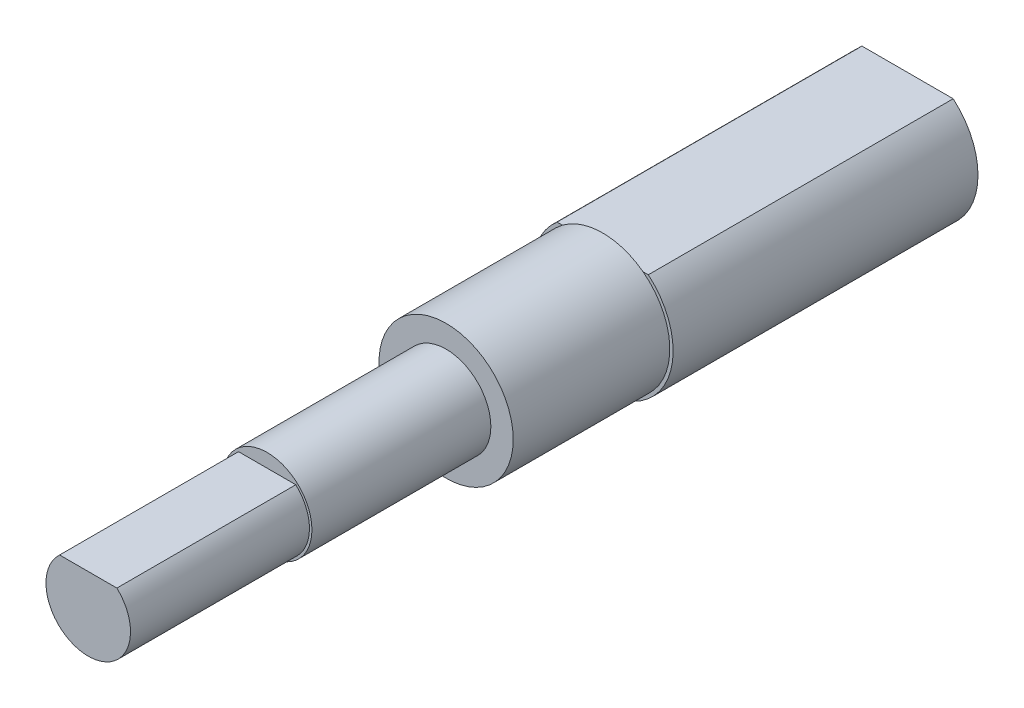
ISO-10303-21;
HEADER;
FILE_DESCRIPTION(('STEP AP214'),'2;1');
FILE_NAME('part.step','',(''),(''),'','','');
FILE_SCHEMA(('AUTOMOTIVE_DESIGN { 1 0 10303 214 1 1 1 1 }'));
ENDSEC;
DATA;
#1=APPLICATION_CONTEXT('core data for automotive mechanical design processes');
#2=APPLICATION_PROTOCOL_DEFINITION('international standard','automotive_design',2000,#1);
#3=PRODUCT_CONTEXT('',#1,'mechanical');
#4=PRODUCT('Part','Part','',(#3));
#5=PRODUCT_RELATED_PRODUCT_CATEGORY('part','',(#4));
#6=PRODUCT_DEFINITION_FORMATION('','',#4);
#7=PRODUCT_DEFINITION_CONTEXT('part definition',#1,'design');
#8=PRODUCT_DEFINITION('design','',#6,#7);
#9=PRODUCT_DEFINITION_SHAPE('','',#8);
#10=(LENGTH_UNIT() NAMED_UNIT(*) SI_UNIT(.MILLI.,.METRE.));
#11=(NAMED_UNIT(*) PLANE_ANGLE_UNIT() SI_UNIT($,.RADIAN.));
#12=(NAMED_UNIT(*) SI_UNIT($,.STERADIAN.) SOLID_ANGLE_UNIT());
#13=UNCERTAINTY_MEASURE_WITH_UNIT(LENGTH_MEASURE(1.E-05),#10,'distance_accuracy_value','');
#14=(GEOMETRIC_REPRESENTATION_CONTEXT(3) GLOBAL_UNCERTAINTY_ASSIGNED_CONTEXT((#13)) GLOBAL_UNIT_ASSIGNED_CONTEXT((#10,
#11,#12)) REPRESENTATION_CONTEXT('',''));
#15=CARTESIAN_POINT('',(0.,0.,0.));
#16=DIRECTION('',(0.,0.,1.));
#17=DIRECTION('',(1.,0.,0.));
#18=AXIS2_PLACEMENT_3D('',#15,#16,#17);
#19=CARTESIAN_POINT('',(0.,0.,21.637500032));
#20=DIRECTION('',(0.,0.,-1.));
#21=DIRECTION('',(-1.,0.,0.));
#22=AXIS2_PLACEMENT_3D('',#19,#20,#21);
#23=CYLINDRICAL_SURFACE('',#22,5.);
#24=CARTESIAN_POINT('',(0.,0.,21.637500032));
#25=DIRECTION('',(0.,0.,1.));
#26=DIRECTION('',(1.,0.,0.));
#27=AXIS2_PLACEMENT_3D('',#24,#25,#26);
#28=CIRCLE('',#27,5.);
#29=CARTESIAN_POINT('',(-3.23862040217358,3.809375,21.637500032));
#30=VERTEX_POINT('',#29);
#31=CARTESIAN_POINT('',(3.23862040217358,3.809375,21.637500032));
#32=VERTEX_POINT('',#31);
#33=EDGE_CURVE('E144',#30,#32,#28,.T.);
#34=ORIENTED_EDGE('',*,*,#33,.F.);
#35=DIRECTION('',(0.,0.,-1.));
#36=VECTOR('',#35,1.);
#37=CARTESIAN_POINT('',(-3.23862040217358,3.809375,21.637500032));
#38=LINE('',#37,#36);
#39=CARTESIAN_POINT('',(-3.23862040217358,3.809375,0.));
#40=VERTEX_POINT('',#39);
#41=EDGE_CURVE('E126',#30,#40,#38,.T.);
#42=ORIENTED_EDGE('',*,*,#41,.T.);
#43=CARTESIAN_POINT('',(0.,0.,0.));
#44=DIRECTION('',(0.,0.,1.));
#45=DIRECTION('',(1.,0.,0.));
#46=AXIS2_PLACEMENT_3D('',#43,#44,#45);
#47=CIRCLE('',#46,5.);
#48=CARTESIAN_POINT('',(3.23862040217358,3.809375,0.));
#49=VERTEX_POINT('',#48);
#50=EDGE_CURVE('E139',#40,#49,#47,.T.);
#51=ORIENTED_EDGE('',*,*,#50,.T.);
#52=DIRECTION('',(0.,0.,-1.));
#53=VECTOR('',#52,1.);
#54=CARTESIAN_POINT('',(3.23862040217358,3.809375,21.637500032));
#55=LINE('',#54,#53);
#56=EDGE_CURVE('E122',#49,#32,#55,.F.);
#57=ORIENTED_EDGE('',*,*,#56,.T.);
#58=EDGE_LOOP('',(#34,#42,#51,#57));
#59=FACE_BOUND('',#58,.T.);
#60=ADVANCED_FACE('F40',(#59),#23,.T.);
#61=CARTESIAN_POINT('',(0.,0.,21.637500032));
#62=DIRECTION('',(0.,0.,1.));
#63=DIRECTION('',(1.,0.,0.));
#64=AXIS2_PLACEMENT_3D('',#61,#62,#63);
#65=PLANE('',#64);
#66=DIRECTION('',(-1.,0.,0.));
#67=VECTOR('',#66,1.);
#68=CARTESIAN_POINT('',(-12.7,3.809375,21.637500032));
#69=LINE('',#68,#67);
#70=CARTESIAN_POINT('',(-2.85833314352526,3.809375,21.637500032));
#71=VERTEX_POINT('',#70);
#72=EDGE_CURVE('E117',#71,#30,#69,.T.);
#73=ORIENTED_EDGE('',*,*,#72,.T.);
#74=ORIENTED_EDGE('',*,*,#33,.T.);
#75=CARTESIAN_POINT('',(2.85833314352526,3.809375,21.637500032));
#76=VERTEX_POINT('',#75);
#77=EDGE_CURVE('E121',#32,#76,#69,.T.);
#78=ORIENTED_EDGE('',*,*,#77,.T.);
#79=CARTESIAN_POINT('',(0.,0.,21.637500032));
#80=DIRECTION('',(0.,0.,1.));
#81=DIRECTION('',(1.,0.,0.));
#82=AXIS2_PLACEMENT_3D('',#79,#80,#81);
#83=CIRCLE('',#82,4.7625);
#84=EDGE_CURVE('E143',#71,#76,#83,.T.);
#85=ORIENTED_EDGE('',*,*,#84,.F.);
#86=EDGE_LOOP('',(#73,#74,#78,#85));
#87=FACE_BOUND('',#86,.T.);
#88=ADVANCED_FACE('F176',(#87),#65,.T.);
#89=CARTESIAN_POINT('',(0.,0.,0.));
#90=DIRECTION('',(0.,0.,1.));
#91=DIRECTION('',(1.,0.,0.));
#92=AXIS2_PLACEMENT_3D('',#89,#90,#91);
#93=PLANE('',#92);
#94=ORIENTED_EDGE('',*,*,#50,.F.);
#95=DIRECTION('',(1.,0.,0.));
#96=VECTOR('',#95,1.);
#97=CARTESIAN_POINT('',(0.,3.809375,0.));
#98=LINE('',#97,#96);
#99=EDGE_CURVE('E108',#40,#49,#98,.T.);
#100=ORIENTED_EDGE('',*,*,#99,.T.);
#101=EDGE_LOOP('',(#94,#100));
#102=FACE_BOUND('',#101,.T.);
#103=ADVANCED_FACE('F153',(#102),#93,.F.);
#104=CARTESIAN_POINT('',(0.,0.,32.750000032));
#105=DIRECTION('',(0.,0.,-1.));
#106=DIRECTION('',(-1.,0.,0.));
#107=AXIS2_PLACEMENT_3D('',#104,#105,#106);
#108=CYLINDRICAL_SURFACE('',#107,4.7625);
#109=CARTESIAN_POINT('',(0.,0.,32.750000032));
#110=DIRECTION('',(0.,0.,1.));
#111=DIRECTION('',(1.,0.,0.));
#112=AXIS2_PLACEMENT_3D('',#109,#110,#111);
#113=CIRCLE('',#112,4.7625);
#114=CARTESIAN_POINT('',(4.7625,0.,32.750000032));
#115=VERTEX_POINT('',#114);
#116=EDGE_CURVE('E133',#115,#115,#113,.T.);
#117=ORIENTED_EDGE('',*,*,#116,.F.);
#118=EDGE_LOOP('',(#117));
#119=FACE_BOUND('',#118,.T.);
#120=EDGE_CURVE('E136',#76,#71,#83,.T.);
#121=ORIENTED_EDGE('',*,*,#120,.T.);
#122=ORIENTED_EDGE('',*,*,#84,.T.);
#123=EDGE_LOOP('',(#121,#122));
#124=FACE_BOUND('',#123,.T.);
#125=ADVANCED_FACE('F184',(#119,#124),#108,.T.);
#126=CARTESIAN_POINT('',(0.,0.,32.750000032));
#127=DIRECTION('',(0.,0.,1.));
#128=DIRECTION('',(1.,0.,0.));
#129=AXIS2_PLACEMENT_3D('',#126,#127,#128);
#130=PLANE('',#129);
#131=CARTESIAN_POINT('',(0.,0.,32.750000032));
#132=DIRECTION('',(0.,0.,1.));
#133=DIRECTION('',(1.,0.,0.));
#134=AXIS2_PLACEMENT_3D('',#131,#132,#133);
#135=CIRCLE('',#134,3.175);
#136=CARTESIAN_POINT('',(3.175,0.,32.750000032));
#137=VERTEX_POINT('',#136);
#138=EDGE_CURVE('E112',#137,#137,#135,.T.);
#139=ORIENTED_EDGE('',*,*,#138,.F.);
#140=EDGE_LOOP('',(#139));
#141=FACE_BOUND('',#140,.T.);
#142=ORIENTED_EDGE('',*,*,#116,.T.);
#143=EDGE_LOOP('',(#142));
#144=FACE_BOUND('',#143,.T.);
#145=ADVANCED_FACE('F188',(#141,#144),#130,.T.);
#146=CARTESIAN_POINT('',(0.,0.,45.450000032));
#147=DIRECTION('',(0.,0.,-1.));
#148=DIRECTION('',(-1.,0.,0.));
#149=AXIS2_PLACEMENT_3D('',#146,#147,#148);
#150=CYLINDRICAL_SURFACE('',#149,3.175);
#151=CARTESIAN_POINT('',(0.,0.,45.450000032));
#152=DIRECTION('',(0.,0.,1.));
#153=DIRECTION('',(1.,0.,0.));
#154=AXIS2_PLACEMENT_3D('',#151,#152,#153);
#155=CIRCLE('',#154,3.175);
#156=CARTESIAN_POINT('',(3.175,0.,45.450000032));
#157=VERTEX_POINT('',#156);
#158=EDGE_CURVE('E130',#157,#157,#155,.T.);
#159=ORIENTED_EDGE('',*,*,#158,.F.);
#160=EDGE_LOOP('',(#159));
#161=FACE_BOUND('',#160,.T.);
#162=ORIENTED_EDGE('',*,*,#138,.T.);
#163=EDGE_LOOP('',(#162));
#164=FACE_BOUND('',#163,.T.);
#165=ADVANCED_FACE('F192',(#161,#164),#150,.T.);
#166=CARTESIAN_POINT('',(0.,0.,45.450000032));
#167=DIRECTION('',(0.,0.,1.));
#168=DIRECTION('',(1.,0.,0.));
#169=AXIS2_PLACEMENT_3D('',#166,#167,#168);
#170=PLANE('',#169);
#171=CARTESIAN_POINT('',(0.,0.,45.450000032));
#172=DIRECTION('',(0.,0.,1.));
#173=DIRECTION('',(1.,0.,0.));
#174=AXIS2_PLACEMENT_3D('',#171,#172,#173);
#175=CIRCLE('',#174,3.);
#176=CARTESIAN_POINT('',(-2.03284552721057,2.20625,45.450000032));
#177=VERTEX_POINT('',#176);
#178=CARTESIAN_POINT('',(2.03284552721057,2.20625,45.450000032));
#179=VERTEX_POINT('',#178);
#180=EDGE_CURVE('E48',#177,#179,#175,.T.);
#181=ORIENTED_EDGE('',*,*,#180,.F.);
#182=DIRECTION('',(-1.,0.,0.));
#183=VECTOR('',#182,1.);
#184=CARTESIAN_POINT('',(12.6862528945437,2.20625,45.450000032));
#185=LINE('',#184,#183);
#186=EDGE_CURVE('E93',#179,#177,#185,.T.);
#187=ORIENTED_EDGE('',*,*,#186,.F.);
#188=EDGE_LOOP('',(#181,#187));
#189=FACE_BOUND('',#188,.T.);
#190=ORIENTED_EDGE('',*,*,#158,.T.);
#191=EDGE_LOOP('',(#190));
#192=FACE_BOUND('',#191,.T.);
#193=ADVANCED_FACE('F102',(#189,#192),#170,.T.);
#194=CARTESIAN_POINT('',(-12.7,3.809375,47.1488769364813));
#195=DIRECTION('',(0.,-1.,0.));
#196=DIRECTION('',(1.,0.,0.));
#197=AXIS2_PLACEMENT_3D('',#194,#195,#196);
#198=PLANE('',#197);
#199=ORIENTED_EDGE('',*,*,#72,.F.);
#200=EDGE_CURVE('E66',#76,#71,#69,.T.);
#201=ORIENTED_EDGE('',*,*,#200,.F.);
#202=ORIENTED_EDGE('',*,*,#77,.F.);
#203=ORIENTED_EDGE('',*,*,#56,.F.);
#204=ORIENTED_EDGE('',*,*,#99,.F.);
#205=ORIENTED_EDGE('',*,*,#41,.F.);
#206=EDGE_LOOP('',(#199,#201,#202,#203,#204,#205));
#207=FACE_BOUND('',#206,.T.);
#208=ADVANCED_FACE('F155',(#207),#198,.F.);
#209=CARTESIAN_POINT('',(0.,0.,21.637500032));
#210=DIRECTION('',(0.,0.,1.));
#211=DIRECTION('',(1.,0.,0.));
#212=AXIS2_PLACEMENT_3D('',#209,#210,#211);
#213=PLANE('',#212);
#214=ORIENTED_EDGE('',*,*,#200,.T.);
#215=ORIENTED_EDGE('',*,*,#120,.F.);
#216=EDGE_LOOP('',(#214,#215));
#217=FACE_BOUND('',#216,.T.);
#218=ADVANCED_FACE('F173',(#217),#213,.F.);
#219=CARTESIAN_POINT('',(0.,0.,58.150000032));
#220=DIRECTION('',(0.,0.,-1.));
#221=DIRECTION('',(-1.,0.,0.));
#222=AXIS2_PLACEMENT_3D('',#219,#220,#221);
#223=CYLINDRICAL_SURFACE('',#222,3.);
#224=CARTESIAN_POINT('',(0.,0.,58.150000032));
#225=DIRECTION('',(0.,0.,1.));
#226=DIRECTION('',(1.,0.,0.));
#227=AXIS2_PLACEMENT_3D('',#224,#225,#226);
#228=CIRCLE('',#227,3.);
#229=CARTESIAN_POINT('',(-2.03284552721057,2.20625,58.150000032));
#230=VERTEX_POINT('',#229);
#231=CARTESIAN_POINT('',(2.03284552721057,2.20625,58.150000032));
#232=VERTEX_POINT('',#231);
#233=EDGE_CURVE('E115',#230,#232,#228,.T.);
#234=ORIENTED_EDGE('',*,*,#233,.F.);
#235=DIRECTION('',(0.,0.,-1.));
#236=VECTOR('',#235,1.);
#237=CARTESIAN_POINT('',(-2.03284552721057,2.20625,58.150000032));
#238=LINE('',#237,#236);
#239=EDGE_CURVE('E57',#230,#177,#238,.T.);
#240=ORIENTED_EDGE('',*,*,#239,.T.);
#241=ORIENTED_EDGE('',*,*,#180,.T.);
#242=DIRECTION('',(0.,0.,-1.));
#243=VECTOR('',#242,1.);
#244=CARTESIAN_POINT('',(2.03284552721057,2.20625,58.150000032));
#245=LINE('',#244,#243);
#246=EDGE_CURVE('E90',#179,#232,#245,.F.);
#247=ORIENTED_EDGE('',*,*,#246,.T.);
#248=EDGE_LOOP('',(#234,#240,#241,#247));
#249=FACE_BOUND('',#248,.T.);
#250=ADVANCED_FACE('F106',(#249),#223,.T.);
#251=CARTESIAN_POINT('',(0.,0.,58.150000032));
#252=DIRECTION('',(0.,0.,1.));
#253=DIRECTION('',(1.,0.,0.));
#254=AXIS2_PLACEMENT_3D('',#251,#252,#253);
#255=PLANE('',#254);
#256=DIRECTION('',(1.,0.,0.));
#257=VECTOR('',#256,1.);
#258=CARTESIAN_POINT('',(0.,2.20625,58.150000032));
#259=LINE('',#258,#257);
#260=EDGE_CURVE('E11',#230,#232,#259,.T.);
#261=ORIENTED_EDGE('',*,*,#260,.F.);
#262=ORIENTED_EDGE('',*,*,#233,.T.);
#263=EDGE_LOOP('',(#261,#262));
#264=FACE_BOUND('',#263,.T.);
#265=ADVANCED_FACE('F165',(#264),#255,.T.);
#266=CARTESIAN_POINT('',(12.6862528945437,2.20625,20.0278796195075));
#267=DIRECTION('',(0.,-1.,0.));
#268=DIRECTION('',(1.,0.,0.));
#269=AXIS2_PLACEMENT_3D('',#266,#267,#268);
#270=PLANE('',#269);
#271=ORIENTED_EDGE('',*,*,#260,.T.);
#272=ORIENTED_EDGE('',*,*,#246,.F.);
#273=ORIENTED_EDGE('',*,*,#186,.T.);
#274=ORIENTED_EDGE('',*,*,#239,.F.);
#275=EDGE_LOOP('',(#271,#272,#273,#274));
#276=FACE_BOUND('',#275,.T.);
#277=ADVANCED_FACE('F92',(#276),#270,.F.);
#278=CLOSED_SHELL('',(#60,#88,#103,#125,#145,#165,#193,#208,#218,#250,#265,#277));
#279=MANIFOLD_SOLID_BREP('B2',#278);
#280=ADVANCED_BREP_SHAPE_REPRESENTATION('',(#18,#279),#14);
#281=SHAPE_DEFINITION_REPRESENTATION(#9,#280);
ENDSEC;
END-ISO-10303-21;
